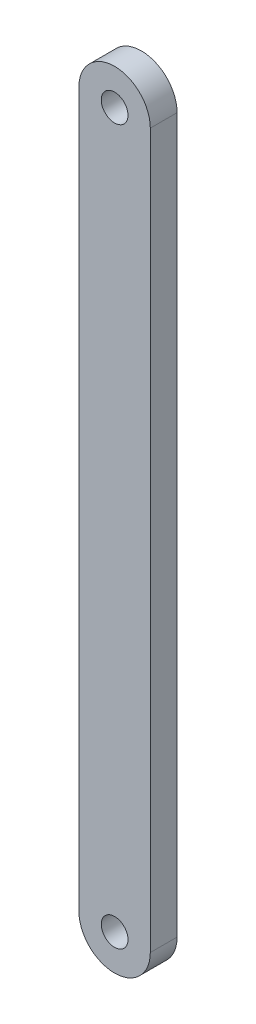
ISO-10303-21;
HEADER;
FILE_DESCRIPTION(('STEP AP214'),'2;1');
FILE_NAME('part.step','',(''),(''),'','','');
FILE_SCHEMA(('AUTOMOTIVE_DESIGN { 1 0 10303 214 1 1 1 1 }'));
ENDSEC;
DATA;
#1=APPLICATION_CONTEXT('core data for automotive mechanical design processes');
#2=APPLICATION_PROTOCOL_DEFINITION('international standard','automotive_design',2000,#1);
#3=PRODUCT_CONTEXT('',#1,'mechanical');
#4=PRODUCT('Part','Part','',(#3));
#5=PRODUCT_RELATED_PRODUCT_CATEGORY('part','',(#4));
#6=PRODUCT_DEFINITION_FORMATION('','',#4);
#7=PRODUCT_DEFINITION_CONTEXT('part definition',#1,'design');
#8=PRODUCT_DEFINITION('design','',#6,#7);
#9=PRODUCT_DEFINITION_SHAPE('','',#8);
#10=(LENGTH_UNIT() NAMED_UNIT(*) SI_UNIT(.MILLI.,.METRE.));
#11=(NAMED_UNIT(*) PLANE_ANGLE_UNIT() SI_UNIT($,.RADIAN.));
#12=(NAMED_UNIT(*) SI_UNIT($,.STERADIAN.) SOLID_ANGLE_UNIT());
#13=UNCERTAINTY_MEASURE_WITH_UNIT(LENGTH_MEASURE(1.E-05),#10,'distance_accuracy_value','');
#14=(GEOMETRIC_REPRESENTATION_CONTEXT(3) GLOBAL_UNCERTAINTY_ASSIGNED_CONTEXT((#13)) GLOBAL_UNIT_ASSIGNED_CONTEXT((#10,
#11,#12)) REPRESENTATION_CONTEXT('',''));
#15=CARTESIAN_POINT('',(0.,0.,0.));
#16=DIRECTION('',(0.,0.,1.));
#17=DIRECTION('',(1.,0.,0.));
#18=AXIS2_PLACEMENT_3D('',#15,#16,#17);
#19=CARTESIAN_POINT('',(36.3000999983873,4.99999999838699,3.));
#20=DIRECTION('',(0.,0.,-1.));
#21=DIRECTION('',(-1.,0.,0.));
#22=AXIS2_PLACEMENT_3D('',#19,#20,#21);
#23=CYLINDRICAL_SURFACE('',#22,3.99999999963689);
#24=CARTESIAN_POINT('',(36.3000999983873,4.99999999838699,0.));
#25=DIRECTION('',(0.,0.,1.));
#26=DIRECTION('',(1.,0.,0.));
#27=AXIS2_PLACEMENT_3D('',#24,#25,#26);
#28=CIRCLE('',#27,3.99999999963689);
#29=CARTESIAN_POINT('',(40.3000999980244,5.000000005807,0.));
#30=VERTEX_POINT('',#29);
#31=CARTESIAN_POINT('',(32.3000999994029,5.00002274841855,0.));
#32=VERTEX_POINT('',#31);
#33=EDGE_CURVE('E105',#30,#32,#28,.F.);
#34=ORIENTED_EDGE('',*,*,#33,.F.);
#35=DIRECTION('',(0.,0.,-1.));
#36=VECTOR('',#35,1.);
#37=CARTESIAN_POINT('',(40.3000999980244,5.000000005807,3.));
#38=LINE('',#37,#36);
#39=CARTESIAN_POINT('',(40.3000999980244,5.000000005807,3.));
#40=VERTEX_POINT('',#39);
#41=EDGE_CURVE('E11',#40,#30,#38,.T.);
#42=ORIENTED_EDGE('',*,*,#41,.F.);
#43=CARTESIAN_POINT('',(36.3000999983873,4.99999999838699,3.));
#44=DIRECTION('',(0.,0.,1.));
#45=DIRECTION('',(1.,0.,0.));
#46=AXIS2_PLACEMENT_3D('',#43,#44,#45);
#47=CIRCLE('',#46,3.99999999963689);
#48=CARTESIAN_POINT('',(32.3000999994029,5.00002274841855,3.));
#49=VERTEX_POINT('',#48);
#50=EDGE_CURVE('E84',#40,#49,#47,.F.);
#51=ORIENTED_EDGE('',*,*,#50,.T.);
#52=DIRECTION('',(0.,0.,-1.));
#53=VECTOR('',#52,1.);
#54=CARTESIAN_POINT('',(32.3000999994029,5.00002274841855,3.));
#55=LINE('',#54,#53);
#56=EDGE_CURVE('E73',#49,#32,#55,.T.);
#57=ORIENTED_EDGE('',*,*,#56,.T.);
#58=EDGE_LOOP('',(#34,#42,#51,#57));
#59=FACE_BOUND('',#58,.T.);
#60=ADVANCED_FACE('F35',(#59),#23,.T.);
#61=CARTESIAN_POINT('',(40.3000999979009,-9.9521458537179E-10,3.));
#62=DIRECTION('',(-1.,2.46950897249294E-11,0.));
#63=DIRECTION('',(-2.46950897249294E-11,-1.,0.));
#64=AXIS2_PLACEMENT_3D('',#61,#62,#63);
#65=PLANE('',#64);
#66=DIRECTION('',(2.46950897249294E-11,1.,0.));
#67=VECTOR('',#66,1.);
#68=CARTESIAN_POINT('',(40.3000999979009,-9.9521458537179E-10,0.));
#69=LINE('',#68,#67);
#70=CARTESIAN_POINT('',(40.3001,85.,0.));
#71=VERTEX_POINT('',#70);
#72=EDGE_CURVE('E90',#30,#71,#69,.T.);
#73=ORIENTED_EDGE('',*,*,#72,.T.);
#74=DIRECTION('',(0.,0.,-1.));
#75=VECTOR('',#74,1.);
#76=CARTESIAN_POINT('',(40.3001,85.,3.));
#77=LINE('',#76,#75);
#78=CARTESIAN_POINT('',(40.3001,85.,3.));
#79=VERTEX_POINT('',#78);
#80=EDGE_CURVE('E43',#79,#71,#77,.T.);
#81=ORIENTED_EDGE('',*,*,#80,.F.);
#82=DIRECTION('',(2.46950897249294E-11,1.,0.));
#83=VECTOR('',#82,1.);
#84=CARTESIAN_POINT('',(40.3000999979009,-9.9521458537179E-10,3.));
#85=LINE('',#84,#83);
#86=EDGE_CURVE('E78',#40,#79,#85,.T.);
#87=ORIENTED_EDGE('',*,*,#86,.F.);
#88=ORIENTED_EDGE('',*,*,#41,.T.);
#89=EDGE_LOOP('',(#73,#81,#87,#88));
#90=FACE_BOUND('',#89,.T.);
#91=ADVANCED_FACE('F88',(#90),#65,.F.);
#92=CARTESIAN_POINT('',(36.3001,85.,3.));
#93=DIRECTION('',(0.,0.,-1.));
#94=DIRECTION('',(-1.,0.,0.));
#95=AXIS2_PLACEMENT_3D('',#92,#93,#94);
#96=CYLINDRICAL_SURFACE('',#95,4.00000000062485);
#97=CARTESIAN_POINT('',(36.3001,85.,0.));
#98=DIRECTION('',(0.,0.,1.));
#99=DIRECTION('',(1.,0.,0.));
#100=AXIS2_PLACEMENT_3D('',#97,#98,#99);
#101=CIRCLE('',#100,4.00000000062485);
#102=CARTESIAN_POINT('',(32.3001000000003,85.0001000000123,0.));
#103=VERTEX_POINT('',#102);
#104=EDGE_CURVE('E109',#103,#71,#101,.F.);
#105=ORIENTED_EDGE('',*,*,#104,.F.);
#106=DIRECTION('',(0.,0.,-1.));
#107=VECTOR('',#106,1.);
#108=CARTESIAN_POINT('',(32.3001000000003,85.0001000000123,3.));
#109=LINE('',#108,#107);
#110=CARTESIAN_POINT('',(32.3001000000003,85.0001000000123,3.));
#111=VERTEX_POINT('',#110);
#112=EDGE_CURVE('E66',#111,#103,#109,.T.);
#113=ORIENTED_EDGE('',*,*,#112,.F.);
#114=CARTESIAN_POINT('',(36.3001,85.,3.));
#115=DIRECTION('',(0.,0.,1.));
#116=DIRECTION('',(1.,0.,0.));
#117=AXIS2_PLACEMENT_3D('',#114,#115,#116);
#118=CIRCLE('',#117,4.00000000062485);
#119=EDGE_CURVE('E83',#111,#79,#118,.F.);
#120=ORIENTED_EDGE('',*,*,#119,.T.);
#121=ORIENTED_EDGE('',*,*,#80,.T.);
#122=EDGE_LOOP('',(#105,#113,#120,#121));
#123=FACE_BOUND('',#122,.T.);
#124=ADVANCED_FACE('F94',(#123),#96,.T.);
#125=CARTESIAN_POINT('',(36.3000999983873,4.99999999838699,3.));
#126=DIRECTION('',(0.,0.,-1.));
#127=DIRECTION('',(-1.,0.,0.));
#128=AXIS2_PLACEMENT_3D('',#125,#126,#127);
#129=CYLINDRICAL_SURFACE('',#128,1.5);
#130=CARTESIAN_POINT('',(36.3000999983873,4.99999999838699,3.));
#131=DIRECTION('',(0.,0.,1.));
#132=DIRECTION('',(1.,0.,0.));
#133=AXIS2_PLACEMENT_3D('',#130,#131,#132);
#134=CIRCLE('',#133,1.5);
#135=CARTESIAN_POINT('',(37.8000999983873,4.99999999838699,3.));
#136=VERTEX_POINT('',#135);
#137=EDGE_CURVE('E96',#136,#136,#134,.T.);
#138=ORIENTED_EDGE('',*,*,#137,.T.);
#139=EDGE_LOOP('',(#138));
#140=FACE_BOUND('',#139,.T.);
#141=CARTESIAN_POINT('',(36.3000999983873,4.99999999838699,0.));
#142=DIRECTION('',(0.,0.,1.));
#143=DIRECTION('',(1.,0.,0.));
#144=AXIS2_PLACEMENT_3D('',#141,#142,#143);
#145=CIRCLE('',#144,1.5);
#146=CARTESIAN_POINT('',(37.8000999983873,4.99999999838699,0.));
#147=VERTEX_POINT('',#146);
#148=EDGE_CURVE('E113',#147,#147,#145,.T.);
#149=ORIENTED_EDGE('',*,*,#148,.F.);
#150=EDGE_LOOP('',(#149));
#151=FACE_BOUND('',#150,.T.);
#152=ADVANCED_FACE('F129',(#140,#151),#129,.F.);
#153=CARTESIAN_POINT('',(32.3000999993656,-2.41202407362191E-10,3.));
#154=DIRECTION('',(1.,-7.46754367221554E-12,0.));
#155=DIRECTION('',(7.46754367221554E-12,1.,0.));
#156=AXIS2_PLACEMENT_3D('',#153,#154,#155);
#157=PLANE('',#156);
#158=DIRECTION('',(-7.46754367221554E-12,-1.,0.));
#159=VECTOR('',#158,1.);
#160=CARTESIAN_POINT('',(32.3000999993656,-2.41202407362191E-10,0.));
#161=LINE('',#160,#159);
#162=EDGE_CURVE('E111',#103,#32,#161,.T.);
#163=ORIENTED_EDGE('',*,*,#162,.T.);
#164=ORIENTED_EDGE('',*,*,#56,.F.);
#165=DIRECTION('',(-7.46754367221554E-12,-1.,0.));
#166=VECTOR('',#165,1.);
#167=CARTESIAN_POINT('',(32.3000999993656,-2.41202407362191E-10,3.));
#168=LINE('',#167,#166);
#169=EDGE_CURVE('E51',#111,#49,#168,.T.);
#170=ORIENTED_EDGE('',*,*,#169,.F.);
#171=ORIENTED_EDGE('',*,*,#112,.T.);
#172=EDGE_LOOP('',(#163,#164,#170,#171));
#173=FACE_BOUND('',#172,.T.);
#174=ADVANCED_FACE('F132',(#173),#157,.F.);
#175=CARTESIAN_POINT('',(36.3001,85.,3.));
#176=DIRECTION('',(0.,0.,-1.));
#177=DIRECTION('',(-1.,0.,0.));
#178=AXIS2_PLACEMENT_3D('',#175,#176,#177);
#179=CYLINDRICAL_SURFACE('',#178,1.5);
#180=CARTESIAN_POINT('',(36.3001,85.,3.));
#181=DIRECTION('',(0.,0.,1.));
#182=DIRECTION('',(1.,0.,0.));
#183=AXIS2_PLACEMENT_3D('',#180,#181,#182);
#184=CIRCLE('',#183,1.5);
#185=CARTESIAN_POINT('',(37.8001,85.,3.));
#186=VERTEX_POINT('',#185);
#187=EDGE_CURVE('E102',#186,#186,#184,.T.);
#188=ORIENTED_EDGE('',*,*,#187,.T.);
#189=EDGE_LOOP('',(#188));
#190=FACE_BOUND('',#189,.T.);
#191=CARTESIAN_POINT('',(36.3001,85.,0.));
#192=DIRECTION('',(0.,0.,1.));
#193=DIRECTION('',(1.,0.,0.));
#194=AXIS2_PLACEMENT_3D('',#191,#192,#193);
#195=CIRCLE('',#194,1.5);
#196=CARTESIAN_POINT('',(37.8001,85.,0.));
#197=VERTEX_POINT('',#196);
#198=EDGE_CURVE('E116',#197,#197,#195,.T.);
#199=ORIENTED_EDGE('',*,*,#198,.F.);
#200=EDGE_LOOP('',(#199));
#201=FACE_BOUND('',#200,.T.);
#202=ADVANCED_FACE('F135',(#190,#201),#179,.F.);
#203=CARTESIAN_POINT('',(0.,0.,3.));
#204=DIRECTION('',(0.,0.,1.));
#205=DIRECTION('',(1.,0.,0.));
#206=AXIS2_PLACEMENT_3D('',#203,#204,#205);
#207=PLANE('',#206);
#208=ORIENTED_EDGE('',*,*,#50,.F.);
#209=ORIENTED_EDGE('',*,*,#86,.T.);
#210=ORIENTED_EDGE('',*,*,#119,.F.);
#211=ORIENTED_EDGE('',*,*,#169,.T.);
#212=EDGE_LOOP('',(#208,#209,#210,#211));
#213=FACE_BOUND('',#212,.T.);
#214=ORIENTED_EDGE('',*,*,#137,.F.);
#215=EDGE_LOOP('',(#214));
#216=FACE_BOUND('',#215,.T.);
#217=ORIENTED_EDGE('',*,*,#187,.F.);
#218=EDGE_LOOP('',(#217));
#219=FACE_BOUND('',#218,.T.);
#220=ADVANCED_FACE('F80',(#213,#216,#219),#207,.T.);
#221=CARTESIAN_POINT('',(0.,0.,0.));
#222=DIRECTION('',(0.,0.,1.));
#223=DIRECTION('',(1.,0.,0.));
#224=AXIS2_PLACEMENT_3D('',#221,#222,#223);
#225=PLANE('',#224);
#226=ORIENTED_EDGE('',*,*,#33,.T.);
#227=ORIENTED_EDGE('',*,*,#162,.F.);
#228=ORIENTED_EDGE('',*,*,#104,.T.);
#229=ORIENTED_EDGE('',*,*,#72,.F.);
#230=EDGE_LOOP('',(#226,#227,#228,#229));
#231=FACE_BOUND('',#230,.T.);
#232=ORIENTED_EDGE('',*,*,#148,.T.);
#233=EDGE_LOOP('',(#232));
#234=FACE_BOUND('',#233,.T.);
#235=ORIENTED_EDGE('',*,*,#198,.T.);
#236=EDGE_LOOP('',(#235));
#237=FACE_BOUND('',#236,.T.);
#238=ADVANCED_FACE('F142',(#231,#234,#237),#225,.F.);
#239=CLOSED_SHELL('',(#60,#91,#124,#152,#174,#202,#220,#238));
#240=MANIFOLD_SOLID_BREP('B2',#239);
#241=ADVANCED_BREP_SHAPE_REPRESENTATION('',(#18,#240),#14);
#242=SHAPE_DEFINITION_REPRESENTATION(#9,#241);
ENDSEC;
END-ISO-10303-21;
